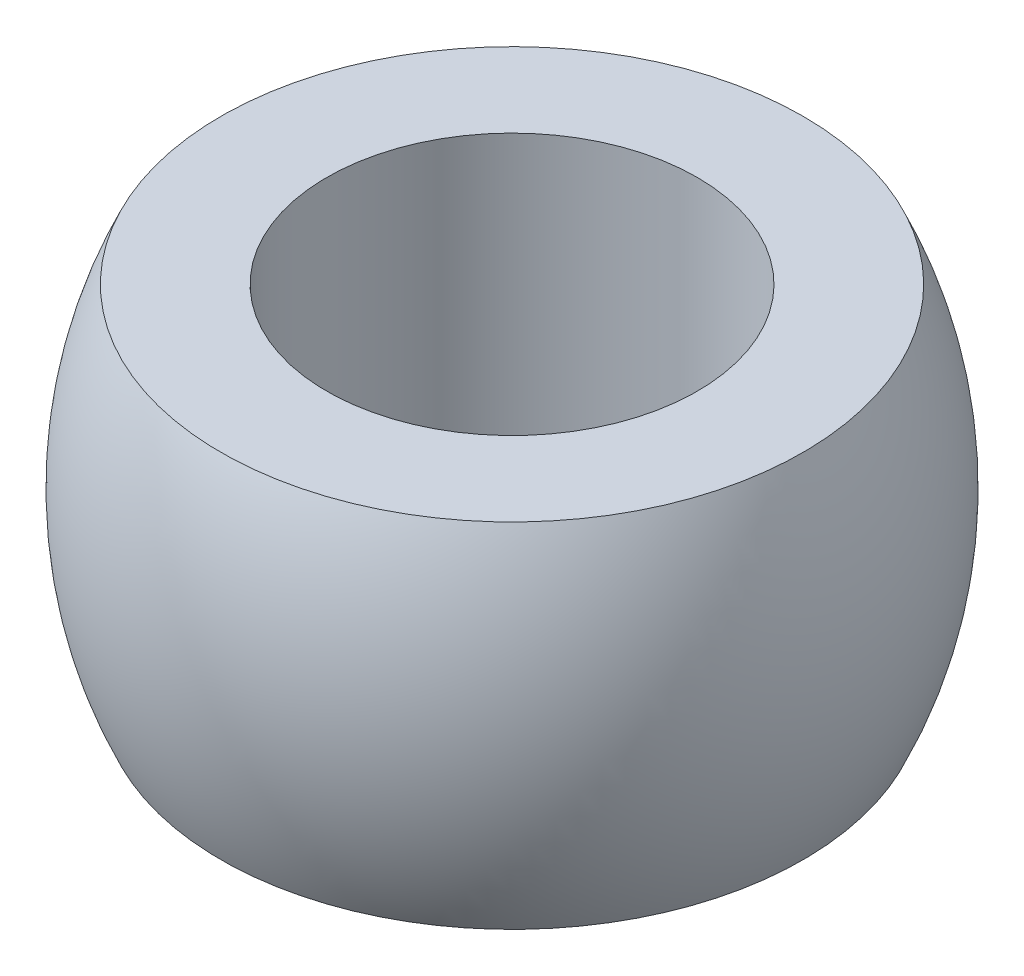
ISO-10303-21;
HEADER;
FILE_DESCRIPTION(('STEP AP214'),'2;1');
FILE_NAME('part.step','',(''),(''),'','','');
FILE_SCHEMA(('AUTOMOTIVE_DESIGN { 1 0 10303 214 1 1 1 1 }'));
ENDSEC;
DATA;
#1=APPLICATION_CONTEXT('core data for automotive mechanical design processes');
#2=APPLICATION_PROTOCOL_DEFINITION('international standard','automotive_design',2000,#1);
#3=PRODUCT_CONTEXT('',#1,'mechanical');
#4=PRODUCT('Part','Part','',(#3));
#5=PRODUCT_RELATED_PRODUCT_CATEGORY('part','',(#4));
#6=PRODUCT_DEFINITION_FORMATION('','',#4);
#7=PRODUCT_DEFINITION_CONTEXT('part definition',#1,'design');
#8=PRODUCT_DEFINITION('design','',#6,#7);
#9=PRODUCT_DEFINITION_SHAPE('','',#8);
#10=(LENGTH_UNIT() NAMED_UNIT(*) SI_UNIT(.MILLI.,.METRE.));
#11=(NAMED_UNIT(*) PLANE_ANGLE_UNIT() SI_UNIT($,.RADIAN.));
#12=(NAMED_UNIT(*) SI_UNIT($,.STERADIAN.) SOLID_ANGLE_UNIT());
#13=UNCERTAINTY_MEASURE_WITH_UNIT(LENGTH_MEASURE(1.E-05),#10,'distance_accuracy_value','');
#14=(GEOMETRIC_REPRESENTATION_CONTEXT(3) GLOBAL_UNCERTAINTY_ASSIGNED_CONTEXT((#13)) GLOBAL_UNIT_ASSIGNED_CONTEXT((#10,
#11,#12)) REPRESENTATION_CONTEXT('',''));
#15=CARTESIAN_POINT('',(0.,0.,0.));
#16=DIRECTION('',(0.,0.,1.));
#17=DIRECTION('',(1.,0.,0.));
#18=AXIS2_PLACEMENT_3D('',#15,#16,#17);
#19=CARTESIAN_POINT('',(-5.25,10.,0.));
#20=DIRECTION('',(0.,-1.,0.));
#21=DIRECTION('',(0.,0.,-1.));
#22=AXIS2_PLACEMENT_3D('',#19,#20,#21);
#23=PLANE('',#22);
#24=CARTESIAN_POINT('',(0.,10.,0.));
#25=DIRECTION('',(0.,-1.,0.));
#26=DIRECTION('',(0.,0.,-1.));
#27=AXIS2_PLACEMENT_3D('',#24,#25,#26);
#28=CIRCLE('',#27,8.25);
#29=CARTESIAN_POINT('',(0.,10.,-8.25));
#30=VERTEX_POINT('',#29);
#31=EDGE_CURVE('E60',#30,#30,#28,.T.);
#32=ORIENTED_EDGE('',*,*,#31,.F.);
#33=EDGE_LOOP('',(#32));
#34=FACE_BOUND('',#33,.T.);
#35=CARTESIAN_POINT('',(0.,10.,0.));
#36=DIRECTION('',(0.,-1.,0.));
#37=DIRECTION('',(0.,0.,-1.));
#38=AXIS2_PLACEMENT_3D('',#35,#36,#37);
#39=CIRCLE('',#38,5.25);
#40=CARTESIAN_POINT('',(0.,10.,-5.25));
#41=VERTEX_POINT('',#40);
#42=EDGE_CURVE('E10',#41,#41,#39,.T.);
#43=ORIENTED_EDGE('',*,*,#42,.T.);
#44=EDGE_LOOP('',(#43));
#45=FACE_BOUND('',#44,.T.);
#46=ADVANCED_FACE('F43',(#34,#45),#23,.F.);
#47=CARTESIAN_POINT('',(0.,0.,0.));
#48=DIRECTION('',(0.,-1.,0.));
#49=DIRECTION('',(0.,0.,-1.));
#50=AXIS2_PLACEMENT_3D('',#47,#48,#49);
#51=CYLINDRICAL_SURFACE('',#50,5.25);
#52=ORIENTED_EDGE('',*,*,#42,.F.);
#53=EDGE_LOOP('',(#52));
#54=FACE_BOUND('',#53,.T.);
#55=CARTESIAN_POINT('',(0.,0.,0.));
#56=DIRECTION('',(0.,-1.,0.));
#57=DIRECTION('',(0.,0.,-1.));
#58=AXIS2_PLACEMENT_3D('',#55,#56,#57);
#59=CIRCLE('',#58,5.25);
#60=CARTESIAN_POINT('',(0.,0.,-5.25));
#61=VERTEX_POINT('',#60);
#62=EDGE_CURVE('E50',#61,#61,#59,.T.);
#63=ORIENTED_EDGE('',*,*,#62,.T.);
#64=EDGE_LOOP('',(#63));
#65=FACE_BOUND('',#64,.T.);
#66=ADVANCED_FACE('F70',(#54,#65),#51,.F.);
#67=CARTESIAN_POINT('',(-5.25,0.,0.));
#68=DIRECTION('',(0.,1.,0.));
#69=DIRECTION('',(0.,0.,1.));
#70=AXIS2_PLACEMENT_3D('',#67,#68,#69);
#71=PLANE('',#70);
#72=ORIENTED_EDGE('',*,*,#62,.F.);
#73=EDGE_LOOP('',(#72));
#74=FACE_BOUND('',#73,.T.);
#75=CARTESIAN_POINT('',(0.,0.,0.));
#76=DIRECTION('',(0.,-1.,0.));
#77=DIRECTION('',(0.,0.,-1.));
#78=AXIS2_PLACEMENT_3D('',#75,#76,#77);
#79=CIRCLE('',#78,8.25);
#80=CARTESIAN_POINT('',(0.,0.,-8.25));
#81=VERTEX_POINT('',#80);
#82=EDGE_CURVE('E55',#81,#81,#79,.T.);
#83=ORIENTED_EDGE('',*,*,#82,.T.);
#84=EDGE_LOOP('',(#83));
#85=FACE_BOUND('',#84,.T.);
#86=ADVANCED_FACE('F74',(#74,#85),#71,.F.);
#87=CARTESIAN_POINT('',(0.,5.,0.));
#88=DIRECTION('',(0.,-1.,0.));
#89=DIRECTION('',(0.,0.,-1.));
#90=AXIS2_PLACEMENT_3D('',#87,#88,#89);
#91=DEGENERATE_TOROIDAL_SURFACE('',#90,2.65871211463571,12.,.F.);
#92=ORIENTED_EDGE('',*,*,#82,.F.);
#93=EDGE_LOOP('',(#92));
#94=FACE_BOUND('',#93,.T.);
#95=ORIENTED_EDGE('',*,*,#31,.T.);
#96=EDGE_LOOP('',(#95));
#97=FACE_BOUND('',#96,.T.);
#98=ADVANCED_FACE('F67',(#94,#97),#91,.F.);
#99=CLOSED_SHELL('',(#46,#66,#86,#98));
#100=MANIFOLD_SOLID_BREP('B2',#99);
#101=ADVANCED_BREP_SHAPE_REPRESENTATION('',(#18,#100),#14);
#102=SHAPE_DEFINITION_REPRESENTATION(#9,#101);
ENDSEC;
END-ISO-10303-21;
